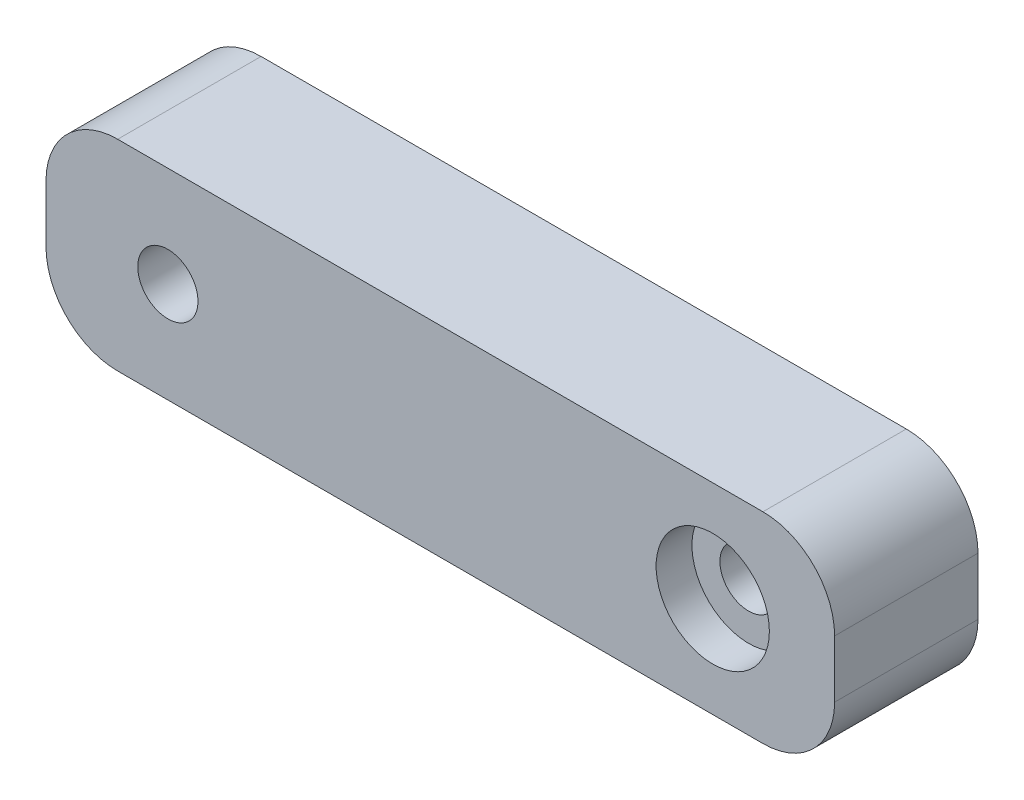
ISO-10303-21;
HEADER;
FILE_DESCRIPTION(('STEP AP214'),'2;1');
FILE_NAME('part.step','',(''),(''),'','','');
FILE_SCHEMA(('AUTOMOTIVE_DESIGN { 1 0 10303 214 1 1 1 1 }'));
ENDSEC;
DATA;
#1=APPLICATION_CONTEXT('core data for automotive mechanical design processes');
#2=APPLICATION_PROTOCOL_DEFINITION('international standard','automotive_design',2000,#1);
#3=PRODUCT_CONTEXT('',#1,'mechanical');
#4=PRODUCT('Part','Part','',(#3));
#5=PRODUCT_RELATED_PRODUCT_CATEGORY('part','',(#4));
#6=PRODUCT_DEFINITION_FORMATION('','',#4);
#7=PRODUCT_DEFINITION_CONTEXT('part definition',#1,'design');
#8=PRODUCT_DEFINITION('design','',#6,#7);
#9=PRODUCT_DEFINITION_SHAPE('','',#8);
#10=(LENGTH_UNIT() NAMED_UNIT(*) SI_UNIT(.MILLI.,.METRE.));
#11=(NAMED_UNIT(*) PLANE_ANGLE_UNIT() SI_UNIT($,.RADIAN.));
#12=(NAMED_UNIT(*) SI_UNIT($,.STERADIAN.) SOLID_ANGLE_UNIT());
#13=UNCERTAINTY_MEASURE_WITH_UNIT(LENGTH_MEASURE(1.E-05),#10,'distance_accuracy_value','');
#14=(GEOMETRIC_REPRESENTATION_CONTEXT(3) GLOBAL_UNCERTAINTY_ASSIGNED_CONTEXT((#13)) GLOBAL_UNIT_ASSIGNED_CONTEXT((#10,
#11,#12)) REPRESENTATION_CONTEXT('',''));
#15=CARTESIAN_POINT('',(0.,0.,0.));
#16=DIRECTION('',(0.,0.,1.));
#17=DIRECTION('',(1.,0.,0.));
#18=AXIS2_PLACEMENT_3D('',#15,#16,#17);
#19=CARTESIAN_POINT('',(-59.3506182432433,20.3019459459459,10.));
#20=DIRECTION('',(1.,0.,0.));
#21=DIRECTION('',(0.,0.,-1.));
#22=AXIS2_PLACEMENT_3D('',#19,#20,#21);
#23=PLANE('',#22);
#24=DIRECTION('',(0.,-1.,0.));
#25=VECTOR('',#24,1.);
#26=CARTESIAN_POINT('',(-59.3506182432433,20.3019459459459,0.));
#27=LINE('',#26,#25);
#28=CARTESIAN_POINT('',(-59.3506182432433,15.3019459459459,0.));
#29=VERTEX_POINT('',#28);
#30=CARTESIAN_POINT('',(-59.3506182432433,11.3019459459459,0.));
#31=VERTEX_POINT('',#30);
#32=EDGE_CURVE('E219',#29,#31,#27,.T.);
#33=ORIENTED_EDGE('',*,*,#32,.T.);
#34=DIRECTION('',(0.,0.,-1.));
#35=VECTOR('',#34,1.);
#36=CARTESIAN_POINT('',(-59.3506182432433,11.3019459459459,10.));
#37=LINE('',#36,#35);
#38=CARTESIAN_POINT('',(-59.3506182432433,11.3019459459459,10.));
#39=VERTEX_POINT('',#38);
#40=EDGE_CURVE('E11',#31,#39,#37,.F.);
#41=ORIENTED_EDGE('',*,*,#40,.T.);
#42=DIRECTION('',(0.,-1.,0.));
#43=VECTOR('',#42,1.);
#44=CARTESIAN_POINT('',(-59.3506182432433,20.3019459459459,10.));
#45=LINE('',#44,#43);
#46=CARTESIAN_POINT('',(-59.3506182432433,15.3019459459459,10.));
#47=VERTEX_POINT('',#46);
#48=EDGE_CURVE('E218',#47,#39,#45,.T.);
#49=ORIENTED_EDGE('',*,*,#48,.F.);
#50=DIRECTION('',(0.,0.,-1.));
#51=VECTOR('',#50,1.);
#52=CARTESIAN_POINT('',(-59.3506182432433,15.3019459459459,0.));
#53=LINE('',#52,#51);
#54=EDGE_CURVE('E235',#47,#29,#53,.T.);
#55=ORIENTED_EDGE('',*,*,#54,.T.);
#56=EDGE_LOOP('',(#33,#41,#49,#55));
#57=FACE_BOUND('',#56,.T.);
#58=ADVANCED_FACE('F41',(#57),#23,.F.);
#59=CARTESIAN_POINT('',(-59.3506182432433,6.30194594594594,10.));
#60=DIRECTION('',(0.,1.,0.));
#61=DIRECTION('',(0.,0.,1.));
#62=AXIS2_PLACEMENT_3D('',#59,#60,#61);
#63=PLANE('',#62);
#64=DIRECTION('',(1.,0.,0.));
#65=VECTOR('',#64,1.);
#66=CARTESIAN_POINT('',(-59.3506182432433,6.30194594594594,0.));
#67=LINE('',#66,#65);
#68=CARTESIAN_POINT('',(-54.3506182432433,6.30194594594594,0.));
#69=VERTEX_POINT('',#68);
#70=CARTESIAN_POINT('',(-9.35061824324325,6.30194594594594,0.));
#71=VERTEX_POINT('',#70);
#72=EDGE_CURVE('E234',#69,#71,#67,.T.);
#73=ORIENTED_EDGE('',*,*,#72,.T.);
#74=DIRECTION('',(0.,0.,-1.));
#75=VECTOR('',#74,1.);
#76=CARTESIAN_POINT('',(-9.35061824324325,6.30194594594594,10.));
#77=LINE('',#76,#75);
#78=CARTESIAN_POINT('',(-9.35061824324325,6.30194594594594,10.));
#79=VERTEX_POINT('',#78);
#80=EDGE_CURVE('E261',#71,#79,#77,.F.);
#81=ORIENTED_EDGE('',*,*,#80,.T.);
#82=DIRECTION('',(1.,0.,0.));
#83=VECTOR('',#82,1.);
#84=CARTESIAN_POINT('',(-59.3506182432433,6.30194594594594,10.));
#85=LINE('',#84,#83);
#86=CARTESIAN_POINT('',(-54.3506182432433,6.30194594594594,10.));
#87=VERTEX_POINT('',#86);
#88=EDGE_CURVE('E224',#87,#79,#85,.T.);
#89=ORIENTED_EDGE('',*,*,#88,.F.);
#90=DIRECTION('',(0.,0.,-1.));
#91=VECTOR('',#90,1.);
#92=CARTESIAN_POINT('',(-54.3506182432433,6.30194594594594,10.));
#93=LINE('',#92,#91);
#94=EDGE_CURVE('E262',#87,#69,#93,.T.);
#95=ORIENTED_EDGE('',*,*,#94,.T.);
#96=EDGE_LOOP('',(#73,#81,#89,#95));
#97=FACE_BOUND('',#96,.T.);
#98=ADVANCED_FACE('F298',(#97),#63,.F.);
#99=CARTESIAN_POINT('',(-4.35061824324325,20.3019459459459,10.));
#100=DIRECTION('',(1.,0.,0.));
#101=DIRECTION('',(0.,0.,-1.));
#102=AXIS2_PLACEMENT_3D('',#99,#100,#101);
#103=PLANE('',#102);
#104=DIRECTION('',(0.,-1.,0.));
#105=VECTOR('',#104,1.);
#106=CARTESIAN_POINT('',(-4.35061824324325,20.3019459459459,10.));
#107=LINE('',#106,#105);
#108=CARTESIAN_POINT('',(-4.35061824324325,15.3019459459459,10.));
#109=VERTEX_POINT('',#108);
#110=CARTESIAN_POINT('',(-4.35061824324325,11.3019459459459,10.));
#111=VERTEX_POINT('',#110);
#112=EDGE_CURVE('E228',#109,#111,#107,.T.);
#113=ORIENTED_EDGE('',*,*,#112,.T.);
#114=DIRECTION('',(0.,0.,-1.));
#115=VECTOR('',#114,1.);
#116=CARTESIAN_POINT('',(-4.35061824324325,11.3019459459459,0.));
#117=LINE('',#116,#115);
#118=CARTESIAN_POINT('',(-4.35061824324325,11.3019459459459,0.));
#119=VERTEX_POINT('',#118);
#120=EDGE_CURVE('E255',#111,#119,#117,.T.);
#121=ORIENTED_EDGE('',*,*,#120,.T.);
#122=DIRECTION('',(0.,-1.,0.));
#123=VECTOR('',#122,1.);
#124=CARTESIAN_POINT('',(-4.35061824324325,20.3019459459459,0.));
#125=LINE('',#124,#123);
#126=CARTESIAN_POINT('',(-4.35061824324325,15.3019459459459,0.));
#127=VERTEX_POINT('',#126);
#128=EDGE_CURVE('E240',#127,#119,#125,.T.);
#129=ORIENTED_EDGE('',*,*,#128,.F.);
#130=DIRECTION('',(0.,0.,-1.));
#131=VECTOR('',#130,1.);
#132=CARTESIAN_POINT('',(-4.35061824324325,15.3019459459459,10.));
#133=LINE('',#132,#131);
#134=EDGE_CURVE('E249',#127,#109,#133,.F.);
#135=ORIENTED_EDGE('',*,*,#134,.T.);
#136=EDGE_LOOP('',(#113,#121,#129,#135));
#137=FACE_BOUND('',#136,.T.);
#138=ADVANCED_FACE('F303',(#137),#103,.T.);
#139=CARTESIAN_POINT('',(-59.3506182432433,20.3019459459459,10.));
#140=DIRECTION('',(0.,1.,0.));
#141=DIRECTION('',(0.,0.,1.));
#142=AXIS2_PLACEMENT_3D('',#139,#140,#141);
#143=PLANE('',#142);
#144=DIRECTION('',(1.,0.,0.));
#145=VECTOR('',#144,1.);
#146=CARTESIAN_POINT('',(-59.3506182432433,20.3019459459459,10.));
#147=LINE('',#146,#145);
#148=CARTESIAN_POINT('',(-54.3506182432433,20.3019459459459,10.));
#149=VERTEX_POINT('',#148);
#150=CARTESIAN_POINT('',(-9.35061824324325,20.3019459459459,10.));
#151=VERTEX_POINT('',#150);
#152=EDGE_CURVE('E230',#149,#151,#147,.T.);
#153=ORIENTED_EDGE('',*,*,#152,.T.);
#154=DIRECTION('',(0.,0.,-1.));
#155=VECTOR('',#154,1.);
#156=CARTESIAN_POINT('',(-9.35061824324325,20.3019459459459,10.));
#157=LINE('',#156,#155);
#158=CARTESIAN_POINT('',(-9.35061824324325,20.3019459459459,0.));
#159=VERTEX_POINT('',#158);
#160=EDGE_CURVE('E47',#151,#159,#157,.T.);
#161=ORIENTED_EDGE('',*,*,#160,.T.);
#162=DIRECTION('',(1.,0.,0.));
#163=VECTOR('',#162,1.);
#164=CARTESIAN_POINT('',(-59.3506182432433,20.3019459459459,0.));
#165=LINE('',#164,#163);
#166=CARTESIAN_POINT('',(-54.3506182432433,20.3019459459459,0.));
#167=VERTEX_POINT('',#166);
#168=EDGE_CURVE('E222',#167,#159,#165,.T.);
#169=ORIENTED_EDGE('',*,*,#168,.F.);
#170=DIRECTION('',(0.,0.,-1.));
#171=VECTOR('',#170,1.);
#172=CARTESIAN_POINT('',(-54.3506182432433,20.3019459459459,10.));
#173=LINE('',#172,#171);
#174=EDGE_CURVE('E246',#167,#149,#173,.F.);
#175=ORIENTED_EDGE('',*,*,#174,.T.);
#176=EDGE_LOOP('',(#153,#161,#169,#175));
#177=FACE_BOUND('',#176,.T.);
#178=ADVANCED_FACE('F273',(#177),#143,.T.);
#179=CARTESIAN_POINT('',(0.,0.,10.));
#180=DIRECTION('',(0.,0.,1.));
#181=DIRECTION('',(1.,0.,0.));
#182=AXIS2_PLACEMENT_3D('',#179,#180,#181);
#183=PLANE('',#182);
#184=CARTESIAN_POINT('',(-50.8506182432433,13.3019459459459,10.));
#185=DIRECTION('',(0.,0.,-1.));
#186=DIRECTION('',(-1.,0.,0.));
#187=AXIS2_PLACEMENT_3D('',#184,#185,#186);
#188=CIRCLE('',#187,2.1);
#189=CARTESIAN_POINT('',(-52.9506182432432,13.3019459459459,10.));
#190=VERTEX_POINT('',#189);
#191=EDGE_CURVE('E205',#190,#190,#188,.T.);
#192=ORIENTED_EDGE('',*,*,#191,.T.);
#193=EDGE_LOOP('',(#192));
#194=FACE_BOUND('',#193,.T.);
#195=CARTESIAN_POINT('',(-12.8506182432433,13.3019459459459,10.));
#196=DIRECTION('',(0.,0.,1.));
#197=DIRECTION('',(1.,0.,0.));
#198=AXIS2_PLACEMENT_3D('',#195,#196,#197);
#199=CIRCLE('',#198,3.95);
#200=CARTESIAN_POINT('',(-8.90061824324325,13.3019459459459,10.));
#201=VERTEX_POINT('',#200);
#202=EDGE_CURVE('E210',#201,#201,#199,.T.);
#203=ORIENTED_EDGE('',*,*,#202,.F.);
#204=EDGE_LOOP('',(#203));
#205=FACE_BOUND('',#204,.T.);
#206=ORIENTED_EDGE('',*,*,#88,.T.);
#207=CARTESIAN_POINT('',(-9.35061824324325,11.3019459459459,10.));
#208=DIRECTION('',(0.,0.,1.));
#209=DIRECTION('',(1.,0.,0.));
#210=AXIS2_PLACEMENT_3D('',#207,#208,#209);
#211=CIRCLE('',#210,5.);
#212=EDGE_CURVE('E266',#79,#111,#211,.T.);
#213=ORIENTED_EDGE('',*,*,#212,.T.);
#214=ORIENTED_EDGE('',*,*,#112,.F.);
#215=CARTESIAN_POINT('',(-9.35061824324325,15.3019459459459,10.));
#216=DIRECTION('',(0.,0.,1.));
#217=DIRECTION('',(1.,0.,0.));
#218=AXIS2_PLACEMENT_3D('',#215,#216,#217);
#219=CIRCLE('',#218,5.);
#220=EDGE_CURVE('E267',#109,#151,#219,.T.);
#221=ORIENTED_EDGE('',*,*,#220,.T.);
#222=ORIENTED_EDGE('',*,*,#152,.F.);
#223=CARTESIAN_POINT('',(-54.3506182432433,15.3019459459459,10.));
#224=DIRECTION('',(0.,0.,1.));
#225=DIRECTION('',(1.,0.,0.));
#226=AXIS2_PLACEMENT_3D('',#223,#224,#225);
#227=CIRCLE('',#226,5.);
#228=EDGE_CURVE('E247',#149,#47,#227,.T.);
#229=ORIENTED_EDGE('',*,*,#228,.T.);
#230=ORIENTED_EDGE('',*,*,#48,.T.);
#231=CARTESIAN_POINT('',(-54.3506182432433,11.3019459459459,10.));
#232=DIRECTION('',(0.,0.,1.));
#233=DIRECTION('',(1.,0.,0.));
#234=AXIS2_PLACEMENT_3D('',#231,#232,#233);
#235=CIRCLE('',#234,5.);
#236=EDGE_CURVE('E268',#39,#87,#235,.T.);
#237=ORIENTED_EDGE('',*,*,#236,.T.);
#238=EDGE_LOOP('',(#206,#213,#214,#221,#222,#229,#230,#237));
#239=FACE_BOUND('',#238,.T.);
#240=ADVANCED_FACE('F286',(#194,#205,#239),#183,.T.);
#241=CARTESIAN_POINT('',(0.,0.,0.));
#242=DIRECTION('',(0.,0.,1.));
#243=DIRECTION('',(1.,0.,0.));
#244=AXIS2_PLACEMENT_3D('',#241,#242,#243);
#245=PLANE('',#244);
#246=DIRECTION('',(0.866025403784448,-0.499999999999983,0.));
#247=VECTOR('',#246,1.);
#248=CARTESIAN_POINT('',(-12.8506182432434,17.3433978302733,0.));
#249=LINE('',#248,#247);
#250=CARTESIAN_POINT('',(-12.8506182432434,17.3433978302733,0.));
#251=VERTEX_POINT('',#250);
#252=CARTESIAN_POINT('',(-9.35061824324326,15.3226718881097,0.));
#253=VERTEX_POINT('',#252);
#254=EDGE_CURVE('E177',#251,#253,#249,.T.);
#255=ORIENTED_EDGE('',*,*,#254,.F.);
#256=DIRECTION('',(0.866025403784448,0.499999999999983,0.));
#257=VECTOR('',#256,1.);
#258=CARTESIAN_POINT('',(-12.8506182432434,17.3433978302733,0.));
#259=LINE('',#258,#257);
#260=CARTESIAN_POINT('',(-16.3506182432435,15.3226718881097,0.));
#261=VERTEX_POINT('',#260);
#262=EDGE_CURVE('E57',#261,#251,#259,.T.);
#263=ORIENTED_EDGE('',*,*,#262,.F.);
#264=DIRECTION('',(0.,1.,0.));
#265=VECTOR('',#264,1.);
#266=CARTESIAN_POINT('',(-16.3506182432435,15.3226718881097,0.));
#267=LINE('',#266,#265);
#268=CARTESIAN_POINT('',(-16.3506182432435,11.2812200037822,0.));
#269=VERTEX_POINT('',#268);
#270=EDGE_CURVE('E161',#269,#261,#267,.T.);
#271=ORIENTED_EDGE('',*,*,#270,.F.);
#272=DIRECTION('',(-0.866025403784448,0.499999999999983,0.));
#273=VECTOR('',#272,1.);
#274=CARTESIAN_POINT('',(-16.3506182432435,11.2812200037822,0.));
#275=LINE('',#274,#273);
#276=CARTESIAN_POINT('',(-12.8506182432434,9.26049406161853,0.));
#277=VERTEX_POINT('',#276);
#278=EDGE_CURVE('E168',#277,#269,#275,.T.);
#279=ORIENTED_EDGE('',*,*,#278,.F.);
#280=DIRECTION('',(-0.866025403784448,-0.499999999999983,0.));
#281=VECTOR('',#280,1.);
#282=CARTESIAN_POINT('',(-9.35061824324326,11.2812200037822,0.));
#283=LINE('',#282,#281);
#284=CARTESIAN_POINT('',(-9.35061824324326,11.2812200037822,0.));
#285=VERTEX_POINT('',#284);
#286=EDGE_CURVE('E183',#285,#277,#283,.T.);
#287=ORIENTED_EDGE('',*,*,#286,.F.);
#288=DIRECTION('',(0.,-1.,0.));
#289=VECTOR('',#288,1.);
#290=CARTESIAN_POINT('',(-9.35061824324326,15.3226718881097,0.));
#291=LINE('',#290,#289);
#292=EDGE_CURVE('E181',#253,#285,#291,.T.);
#293=ORIENTED_EDGE('',*,*,#292,.F.);
#294=EDGE_LOOP('',(#255,#263,#271,#279,#287,#293));
#295=FACE_BOUND('',#294,.T.);
#296=CARTESIAN_POINT('',(-50.8506182432433,13.3019459459459,0.));
#297=DIRECTION('',(0.,0.,-1.));
#298=DIRECTION('',(-1.,0.,0.));
#299=AXIS2_PLACEMENT_3D('',#296,#297,#298);
#300=CIRCLE('',#299,4.);
#301=CARTESIAN_POINT('',(-54.8506182432432,13.3019459459459,0.));
#302=VERTEX_POINT('',#301);
#303=EDGE_CURVE('E212',#302,#302,#300,.T.);
#304=ORIENTED_EDGE('',*,*,#303,.F.);
#305=EDGE_LOOP('',(#304));
#306=FACE_BOUND('',#305,.T.);
#307=ORIENTED_EDGE('',*,*,#128,.T.);
#308=CARTESIAN_POINT('',(-9.35061824324325,11.3019459459459,0.));
#309=DIRECTION('',(0.,0.,1.));
#310=DIRECTION('',(1.,0.,0.));
#311=AXIS2_PLACEMENT_3D('',#308,#309,#310);
#312=CIRCLE('',#311,5.);
#313=EDGE_CURVE('E258',#119,#71,#312,.F.);
#314=ORIENTED_EDGE('',*,*,#313,.T.);
#315=ORIENTED_EDGE('',*,*,#72,.F.);
#316=CARTESIAN_POINT('',(-54.3506182432433,11.3019459459459,0.));
#317=DIRECTION('',(0.,0.,1.));
#318=DIRECTION('',(1.,0.,0.));
#319=AXIS2_PLACEMENT_3D('',#316,#317,#318);
#320=CIRCLE('',#319,5.);
#321=EDGE_CURVE('E253',#69,#31,#320,.F.);
#322=ORIENTED_EDGE('',*,*,#321,.T.);
#323=ORIENTED_EDGE('',*,*,#32,.F.);
#324=CARTESIAN_POINT('',(-54.3506182432433,15.3019459459459,0.));
#325=DIRECTION('',(0.,0.,1.));
#326=DIRECTION('',(1.,0.,0.));
#327=AXIS2_PLACEMENT_3D('',#324,#325,#326);
#328=CIRCLE('',#327,5.);
#329=EDGE_CURVE('E242',#29,#167,#328,.F.);
#330=ORIENTED_EDGE('',*,*,#329,.T.);
#331=ORIENTED_EDGE('',*,*,#168,.T.);
#332=CARTESIAN_POINT('',(-9.35061824324325,15.3019459459459,0.));
#333=DIRECTION('',(0.,0.,1.));
#334=DIRECTION('',(1.,0.,0.));
#335=AXIS2_PLACEMENT_3D('',#332,#333,#334);
#336=CIRCLE('',#335,5.);
#337=EDGE_CURVE('E260',#159,#127,#336,.F.);
#338=ORIENTED_EDGE('',*,*,#337,.T.);
#339=EDGE_LOOP('',(#307,#314,#315,#322,#323,#330,#331,#338));
#340=FACE_BOUND('',#339,.T.);
#341=ADVANCED_FACE('F282',(#295,#306,#340),#245,.F.);
#342=CARTESIAN_POINT('',(-54.3506182432433,15.3019459459459,10.));
#343=DIRECTION('',(0.,0.,1.));
#344=DIRECTION('',(1.,0.,0.));
#345=AXIS2_PLACEMENT_3D('',#342,#343,#344);
#346=CYLINDRICAL_SURFACE('',#345,5.);
#347=ORIENTED_EDGE('',*,*,#228,.F.);
#348=ORIENTED_EDGE('',*,*,#174,.F.);
#349=ORIENTED_EDGE('',*,*,#329,.F.);
#350=ORIENTED_EDGE('',*,*,#54,.F.);
#351=EDGE_LOOP('',(#347,#348,#349,#350));
#352=FACE_BOUND('',#351,.T.);
#353=ADVANCED_FACE('F289',(#352),#346,.T.);
#354=CARTESIAN_POINT('',(-9.35061824324325,11.3019459459459,10.));
#355=DIRECTION('',(0.,0.,1.));
#356=DIRECTION('',(1.,0.,0.));
#357=AXIS2_PLACEMENT_3D('',#354,#355,#356);
#358=CYLINDRICAL_SURFACE('',#357,5.);
#359=ORIENTED_EDGE('',*,*,#212,.F.);
#360=ORIENTED_EDGE('',*,*,#80,.F.);
#361=ORIENTED_EDGE('',*,*,#313,.F.);
#362=ORIENTED_EDGE('',*,*,#120,.F.);
#363=EDGE_LOOP('',(#359,#360,#361,#362));
#364=FACE_BOUND('',#363,.T.);
#365=ADVANCED_FACE('F301',(#364),#358,.T.);
#366=CARTESIAN_POINT('',(-9.35061824324325,15.3019459459459,10.));
#367=DIRECTION('',(0.,0.,-1.));
#368=DIRECTION('',(-1.,0.,0.));
#369=AXIS2_PLACEMENT_3D('',#366,#367,#368);
#370=CYLINDRICAL_SURFACE('',#369,5.);
#371=ORIENTED_EDGE('',*,*,#220,.F.);
#372=ORIENTED_EDGE('',*,*,#134,.F.);
#373=ORIENTED_EDGE('',*,*,#337,.F.);
#374=ORIENTED_EDGE('',*,*,#160,.F.);
#375=EDGE_LOOP('',(#371,#372,#373,#374));
#376=FACE_BOUND('',#375,.T.);
#377=ADVANCED_FACE('F306',(#376),#370,.T.);
#378=CARTESIAN_POINT('',(-54.3506182432433,11.3019459459459,10.));
#379=DIRECTION('',(0.,0.,-1.));
#380=DIRECTION('',(-1.,0.,0.));
#381=AXIS2_PLACEMENT_3D('',#378,#379,#380);
#382=CYLINDRICAL_SURFACE('',#381,5.);
#383=ORIENTED_EDGE('',*,*,#236,.F.);
#384=ORIENTED_EDGE('',*,*,#40,.F.);
#385=ORIENTED_EDGE('',*,*,#321,.F.);
#386=ORIENTED_EDGE('',*,*,#94,.F.);
#387=EDGE_LOOP('',(#383,#384,#385,#386));
#388=FACE_BOUND('',#387,.T.);
#389=ADVANCED_FACE('F43',(#388),#382,.T.);
#390=CARTESIAN_POINT('',(-50.8506182432433,13.3019459459459,2.5));
#391=DIRECTION('',(0.,0.,-1.));
#392=DIRECTION('',(-1.,0.,0.));
#393=AXIS2_PLACEMENT_3D('',#390,#391,#392);
#394=CYLINDRICAL_SURFACE('',#393,4.);
#395=CARTESIAN_POINT('',(-50.8506182432433,13.3019459459459,2.5));
#396=DIRECTION('',(0.,0.,-1.));
#397=DIRECTION('',(-1.,0.,0.));
#398=AXIS2_PLACEMENT_3D('',#395,#396,#397);
#399=CIRCLE('',#398,4.);
#400=CARTESIAN_POINT('',(-54.8506182432432,13.3019459459459,2.5));
#401=VERTEX_POINT('',#400);
#402=EDGE_CURVE('E213',#401,#401,#399,.T.);
#403=ORIENTED_EDGE('',*,*,#402,.F.);
#404=EDGE_LOOP('',(#403));
#405=FACE_BOUND('',#404,.T.);
#406=ORIENTED_EDGE('',*,*,#303,.T.);
#407=EDGE_LOOP('',(#406));
#408=FACE_BOUND('',#407,.T.);
#409=ADVANCED_FACE('F315',(#405,#408),#394,.F.);
#410=CARTESIAN_POINT('',(-50.8506182432433,13.3019459459459,2.5));
#411=DIRECTION('',(0.,0.,-1.));
#412=DIRECTION('',(-1.,0.,0.));
#413=AXIS2_PLACEMENT_3D('',#410,#411,#412);
#414=PLANE('',#413);
#415=CARTESIAN_POINT('',(-50.8506182432433,13.3019459459459,2.5));
#416=DIRECTION('',(0.,0.,-1.));
#417=DIRECTION('',(-1.,0.,0.));
#418=AXIS2_PLACEMENT_3D('',#415,#416,#417);
#419=CIRCLE('',#418,2.1);
#420=CARTESIAN_POINT('',(-52.9506182432432,13.3019459459459,2.5));
#421=VERTEX_POINT('',#420);
#422=EDGE_CURVE('E208',#421,#421,#419,.T.);
#423=ORIENTED_EDGE('',*,*,#422,.F.);
#424=EDGE_LOOP('',(#423));
#425=FACE_BOUND('',#424,.T.);
#426=ORIENTED_EDGE('',*,*,#402,.T.);
#427=EDGE_LOOP('',(#426));
#428=FACE_BOUND('',#427,.T.);
#429=ADVANCED_FACE('F377',(#425,#428),#414,.T.);
#430=CARTESIAN_POINT('',(-50.8506182432433,13.3019459459459,4.5));
#431=DIRECTION('',(0.,0.,-1.));
#432=DIRECTION('',(-1.,0.,0.));
#433=AXIS2_PLACEMENT_3D('',#430,#431,#432);
#434=CYLINDRICAL_SURFACE('',#433,2.1);
#435=ORIENTED_EDGE('',*,*,#422,.T.);
#436=EDGE_LOOP('',(#435));
#437=FACE_BOUND('',#436,.T.);
#438=ORIENTED_EDGE('',*,*,#191,.F.);
#439=EDGE_LOOP('',(#438));
#440=FACE_BOUND('',#439,.T.);
#441=ADVANCED_FACE('F390',(#437,#440),#434,.F.);
#442=CARTESIAN_POINT('',(-12.8506182432433,13.3019459459459,5.));
#443=DIRECTION('',(0.,0.,1.));
#444=DIRECTION('',(1.,0.,0.));
#445=AXIS2_PLACEMENT_3D('',#442,#443,#444);
#446=CYLINDRICAL_SURFACE('',#445,3.95);
#447=CARTESIAN_POINT('',(-12.8506182432433,13.3019459459459,7.5));
#448=DIRECTION('',(0.,0.,1.));
#449=DIRECTION('',(1.,0.,0.));
#450=AXIS2_PLACEMENT_3D('',#447,#448,#449);
#451=CIRCLE('',#450,3.95);
#452=CARTESIAN_POINT('',(-8.90061824324325,13.3019459459459,7.5));
#453=VERTEX_POINT('',#452);
#454=EDGE_CURVE('E203',#453,#453,#451,.T.);
#455=ORIENTED_EDGE('',*,*,#454,.F.);
#456=EDGE_LOOP('',(#455));
#457=FACE_BOUND('',#456,.T.);
#458=ORIENTED_EDGE('',*,*,#202,.T.);
#459=EDGE_LOOP('',(#458));
#460=FACE_BOUND('',#459,.T.);
#461=ADVANCED_FACE('F397',(#457,#460),#446,.F.);
#462=CARTESIAN_POINT('',(-12.8506182432433,13.3019459459459,-0.00100000000000013));
#463=DIRECTION('',(0.,0.,1.));
#464=DIRECTION('',(1.,0.,0.));
#465=AXIS2_PLACEMENT_3D('',#462,#463,#464);
#466=CYLINDRICAL_SURFACE('',#465,2.);
#467=CARTESIAN_POINT('',(-12.8506182432433,13.3019459459459,3.));
#468=DIRECTION('',(0.,0.,-1.));
#469=DIRECTION('',(-1.,0.,0.));
#470=AXIS2_PLACEMENT_3D('',#467,#468,#469);
#471=CIRCLE('',#470,2.);
#472=CARTESIAN_POINT('',(-14.8506182432433,13.3019459459459,3.));
#473=VERTEX_POINT('',#472);
#474=EDGE_CURVE('E169',#473,#473,#471,.T.);
#475=ORIENTED_EDGE('',*,*,#474,.T.);
#476=EDGE_LOOP('',(#475));
#477=FACE_BOUND('',#476,.T.);
#478=CARTESIAN_POINT('',(-12.8506182432433,13.3019459459459,7.5));
#479=DIRECTION('',(0.,0.,1.));
#480=DIRECTION('',(1.,0.,0.));
#481=AXIS2_PLACEMENT_3D('',#478,#479,#480);
#482=CIRCLE('',#481,2.);
#483=CARTESIAN_POINT('',(-10.8506182432433,13.3019459459459,7.5));
#484=VERTEX_POINT('',#483);
#485=EDGE_CURVE('E191',#484,#484,#482,.T.);
#486=ORIENTED_EDGE('',*,*,#485,.T.);
#487=EDGE_LOOP('',(#486));
#488=FACE_BOUND('',#487,.T.);
#489=ADVANCED_FACE('F409',(#477,#488),#466,.F.);
#490=CARTESIAN_POINT('',(-12.8506182432433,13.3019459459459,7.5));
#491=DIRECTION('',(0.,0.,1.));
#492=DIRECTION('',(1.,0.,0.));
#493=AXIS2_PLACEMENT_3D('',#490,#491,#492);
#494=PLANE('',#493);
#495=ORIENTED_EDGE('',*,*,#454,.T.);
#496=EDGE_LOOP('',(#495));
#497=FACE_BOUND('',#496,.T.);
#498=ORIENTED_EDGE('',*,*,#485,.F.);
#499=EDGE_LOOP('',(#498));
#500=FACE_BOUND('',#499,.T.);
#501=ADVANCED_FACE('F417',(#497,#500),#494,.T.);
#502=CARTESIAN_POINT('',(-12.8506182432434,17.3433978302733,3.));
#503=DIRECTION('',(-0.499999999999983,0.866025403784448,0.));
#504=DIRECTION('',(-0.866025403784448,-0.499999999999983,0.));
#505=AXIS2_PLACEMENT_3D('',#502,#503,#504);
#506=PLANE('',#505);
#507=ORIENTED_EDGE('',*,*,#262,.T.);
#508=DIRECTION('',(0.,0.,-1.));
#509=VECTOR('',#508,1.);
#510=CARTESIAN_POINT('',(-12.8506182432434,17.3433978302733,3.));
#511=LINE('',#510,#509);
#512=CARTESIAN_POINT('',(-12.8506182432434,17.3433978302733,3.));
#513=VERTEX_POINT('',#512);
#514=EDGE_CURVE('E136',#513,#251,#511,.T.);
#515=ORIENTED_EDGE('',*,*,#514,.F.);
#516=DIRECTION('',(0.866025403784448,0.499999999999983,0.));
#517=VECTOR('',#516,1.);
#518=CARTESIAN_POINT('',(-12.8506182432434,17.3433978302733,3.));
#519=LINE('',#518,#517);
#520=CARTESIAN_POINT('',(-16.3506182432435,15.3226718881097,3.));
#521=VERTEX_POINT('',#520);
#522=EDGE_CURVE('E144',#521,#513,#519,.T.);
#523=ORIENTED_EDGE('',*,*,#522,.F.);
#524=DIRECTION('',(0.,0.,-1.));
#525=VECTOR('',#524,1.);
#526=CARTESIAN_POINT('',(-16.3506182432435,15.3226718881097,3.));
#527=LINE('',#526,#525);
#528=EDGE_CURVE('E186',#521,#261,#527,.T.);
#529=ORIENTED_EDGE('',*,*,#528,.T.);
#530=EDGE_LOOP('',(#507,#515,#523,#529));
#531=FACE_BOUND('',#530,.T.);
#532=ADVANCED_FACE('F145',(#531),#506,.F.);
#533=CARTESIAN_POINT('',(-16.3506182432435,15.3226718881097,3.));
#534=DIRECTION('',(-1.,0.,0.));
#535=DIRECTION('',(0.,0.,1.));
#536=AXIS2_PLACEMENT_3D('',#533,#534,#535);
#537=PLANE('',#536);
#538=ORIENTED_EDGE('',*,*,#270,.T.);
#539=ORIENTED_EDGE('',*,*,#528,.F.);
#540=DIRECTION('',(0.,1.,0.));
#541=VECTOR('',#540,1.);
#542=CARTESIAN_POINT('',(-16.3506182432435,15.3226718881097,3.));
#543=LINE('',#542,#541);
#544=CARTESIAN_POINT('',(-16.3506182432435,11.2812200037822,3.));
#545=VERTEX_POINT('',#544);
#546=EDGE_CURVE('E149',#545,#521,#543,.T.);
#547=ORIENTED_EDGE('',*,*,#546,.F.);
#548=DIRECTION('',(0.,0.,-1.));
#549=VECTOR('',#548,1.);
#550=CARTESIAN_POINT('',(-16.3506182432435,11.2812200037822,3.));
#551=LINE('',#550,#549);
#552=EDGE_CURVE('E195',#545,#269,#551,.T.);
#553=ORIENTED_EDGE('',*,*,#552,.T.);
#554=EDGE_LOOP('',(#538,#539,#547,#553));
#555=FACE_BOUND('',#554,.T.);
#556=ADVANCED_FACE('F437',(#555),#537,.F.);
#557=CARTESIAN_POINT('',(-16.3506182432435,11.2812200037822,3.));
#558=DIRECTION('',(-0.499999999999983,-0.866025403784448,0.));
#559=DIRECTION('',(0.866025403784448,-0.499999999999983,0.));
#560=AXIS2_PLACEMENT_3D('',#557,#558,#559);
#561=PLANE('',#560);
#562=ORIENTED_EDGE('',*,*,#278,.T.);
#563=ORIENTED_EDGE('',*,*,#552,.F.);
#564=DIRECTION('',(-0.866025403784448,0.499999999999983,0.));
#565=VECTOR('',#564,1.);
#566=CARTESIAN_POINT('',(-16.3506182432435,11.2812200037822,3.));
#567=LINE('',#566,#565);
#568=CARTESIAN_POINT('',(-12.8506182432434,9.26049406161853,3.));
#569=VERTEX_POINT('',#568);
#570=EDGE_CURVE('E174',#569,#545,#567,.T.);
#571=ORIENTED_EDGE('',*,*,#570,.F.);
#572=DIRECTION('',(0.,0.,-1.));
#573=VECTOR('',#572,1.);
#574=CARTESIAN_POINT('',(-12.8506182432434,9.26049406161853,3.));
#575=LINE('',#574,#573);
#576=EDGE_CURVE('E193',#569,#277,#575,.T.);
#577=ORIENTED_EDGE('',*,*,#576,.T.);
#578=EDGE_LOOP('',(#562,#563,#571,#577));
#579=FACE_BOUND('',#578,.T.);
#580=ADVANCED_FACE('F449',(#579),#561,.F.);
#581=CARTESIAN_POINT('',(-9.35061824324326,11.2812200037822,3.));
#582=DIRECTION('',(0.499999999999983,-0.866025403784449,0.));
#583=DIRECTION('',(0.866025403784449,0.499999999999983,0.));
#584=AXIS2_PLACEMENT_3D('',#581,#582,#583);
#585=PLANE('',#584);
#586=ORIENTED_EDGE('',*,*,#286,.T.);
#587=ORIENTED_EDGE('',*,*,#576,.F.);
#588=DIRECTION('',(-0.866025403784448,-0.499999999999983,0.));
#589=VECTOR('',#588,1.);
#590=CARTESIAN_POINT('',(-9.35061824324326,11.2812200037822,3.));
#591=LINE('',#590,#589);
#592=CARTESIAN_POINT('',(-9.35061824324326,11.2812200037822,3.));
#593=VERTEX_POINT('',#592);
#594=EDGE_CURVE('E175',#593,#569,#591,.T.);
#595=ORIENTED_EDGE('',*,*,#594,.F.);
#596=DIRECTION('',(0.,0.,-1.));
#597=VECTOR('',#596,1.);
#598=CARTESIAN_POINT('',(-9.35061824324326,11.2812200037822,3.));
#599=LINE('',#598,#597);
#600=EDGE_CURVE('E197',#593,#285,#599,.T.);
#601=ORIENTED_EDGE('',*,*,#600,.T.);
#602=EDGE_LOOP('',(#586,#587,#595,#601));
#603=FACE_BOUND('',#602,.T.);
#604=ADVANCED_FACE('F460',(#603),#585,.F.);
#605=CARTESIAN_POINT('',(-9.35061824324326,15.3226718881097,3.));
#606=DIRECTION('',(1.,0.,0.));
#607=DIRECTION('',(0.,0.,-1.));
#608=AXIS2_PLACEMENT_3D('',#605,#606,#607);
#609=PLANE('',#608);
#610=ORIENTED_EDGE('',*,*,#292,.T.);
#611=ORIENTED_EDGE('',*,*,#600,.F.);
#612=DIRECTION('',(0.,-1.,0.));
#613=VECTOR('',#612,1.);
#614=CARTESIAN_POINT('',(-9.35061824324326,15.3226718881097,3.));
#615=LINE('',#614,#613);
#616=CARTESIAN_POINT('',(-9.35061824324326,15.3226718881097,3.));
#617=VERTEX_POINT('',#616);
#618=EDGE_CURVE('E157',#617,#593,#615,.T.);
#619=ORIENTED_EDGE('',*,*,#618,.F.);
#620=DIRECTION('',(0.,0.,-1.));
#621=VECTOR('',#620,1.);
#622=CARTESIAN_POINT('',(-9.35061824324326,15.3226718881097,3.));
#623=LINE('',#622,#621);
#624=EDGE_CURVE('E148',#617,#253,#623,.T.);
#625=ORIENTED_EDGE('',*,*,#624,.T.);
#626=EDGE_LOOP('',(#610,#611,#619,#625));
#627=FACE_BOUND('',#626,.T.);
#628=ADVANCED_FACE('F466',(#627),#609,.F.);
#629=CARTESIAN_POINT('',(-12.8506182432434,17.3433978302733,3.));
#630=DIRECTION('',(0.499999999999983,0.866025403784449,0.));
#631=DIRECTION('',(-0.866025403784449,0.499999999999983,0.));
#632=AXIS2_PLACEMENT_3D('',#629,#630,#631);
#633=PLANE('',#632);
#634=ORIENTED_EDGE('',*,*,#254,.T.);
#635=ORIENTED_EDGE('',*,*,#624,.F.);
#636=DIRECTION('',(0.866025403784448,-0.499999999999983,0.));
#637=VECTOR('',#636,1.);
#638=CARTESIAN_POINT('',(-12.8506182432434,17.3433978302733,3.));
#639=LINE('',#638,#637);
#640=EDGE_CURVE('E155',#513,#617,#639,.T.);
#641=ORIENTED_EDGE('',*,*,#640,.F.);
#642=ORIENTED_EDGE('',*,*,#514,.T.);
#643=EDGE_LOOP('',(#634,#635,#641,#642));
#644=FACE_BOUND('',#643,.T.);
#645=ADVANCED_FACE('F151',(#644),#633,.F.);
#646=CARTESIAN_POINT('',(0.,0.,3.));
#647=DIRECTION('',(0.,0.,1.));
#648=DIRECTION('',(1.,0.,0.));
#649=AXIS2_PLACEMENT_3D('',#646,#647,#648);
#650=PLANE('',#649);
#651=ORIENTED_EDGE('',*,*,#474,.F.);
#652=EDGE_LOOP('',(#651));
#653=FACE_BOUND('',#652,.T.);
#654=ORIENTED_EDGE('',*,*,#522,.T.);
#655=ORIENTED_EDGE('',*,*,#640,.T.);
#656=ORIENTED_EDGE('',*,*,#618,.T.);
#657=ORIENTED_EDGE('',*,*,#594,.T.);
#658=ORIENTED_EDGE('',*,*,#570,.T.);
#659=ORIENTED_EDGE('',*,*,#546,.T.);
#660=EDGE_LOOP('',(#654,#655,#656,#657,#658,#659));
#661=FACE_BOUND('',#660,.T.);
#662=ADVANCED_FACE('F156',(#653,#661),#650,.F.);
#663=CLOSED_SHELL('',(#58,#98,#138,#178,#240,#341,#353,#365,#377,#389,#409,#429,#441,#461,#489,
#501,#532,#556,#580,#604,#628,#645,#662));
#664=MANIFOLD_SOLID_BREP('B2',#663);
#665=ADVANCED_BREP_SHAPE_REPRESENTATION('',(#18,#664),#14);
#666=SHAPE_DEFINITION_REPRESENTATION(#9,#665);
ENDSEC;
END-ISO-10303-21;
